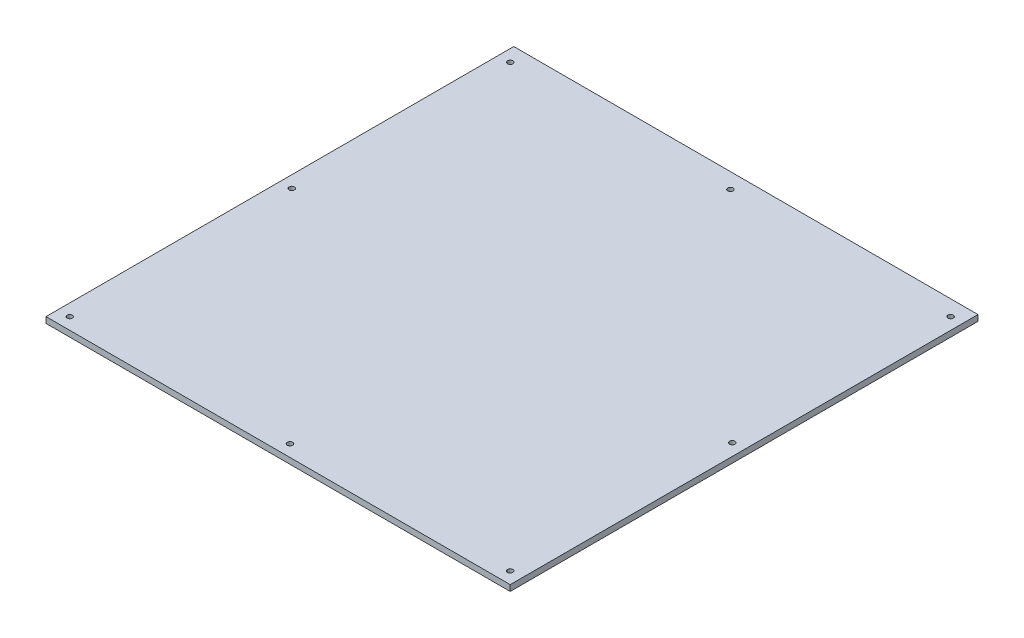
ISO-10303-21;
HEADER;
FILE_DESCRIPTION(('STEP AP214'),'2;1');
FILE_NAME('part.step','',(''),(''),'','','');
FILE_SCHEMA(('AUTOMOTIVE_DESIGN { 1 0 10303 214 1 1 1 1 }'));
ENDSEC;
DATA;
#1=APPLICATION_CONTEXT('core data for automotive mechanical design processes');
#2=APPLICATION_PROTOCOL_DEFINITION('international standard','automotive_design',2000,#1);
#3=PRODUCT_CONTEXT('',#1,'mechanical');
#4=PRODUCT('Part','Part','',(#3));
#5=PRODUCT_RELATED_PRODUCT_CATEGORY('part','',(#4));
#6=PRODUCT_DEFINITION_FORMATION('','',#4);
#7=PRODUCT_DEFINITION_CONTEXT('part definition',#1,'design');
#8=PRODUCT_DEFINITION('design','',#6,#7);
#9=PRODUCT_DEFINITION_SHAPE('','',#8);
#10=(LENGTH_UNIT() NAMED_UNIT(*) SI_UNIT(.MILLI.,.METRE.));
#11=(NAMED_UNIT(*) PLANE_ANGLE_UNIT() SI_UNIT($,.RADIAN.));
#12=(NAMED_UNIT(*) SI_UNIT($,.STERADIAN.) SOLID_ANGLE_UNIT());
#13=UNCERTAINTY_MEASURE_WITH_UNIT(LENGTH_MEASURE(1.E-05),#10,'distance_accuracy_value','');
#14=(GEOMETRIC_REPRESENTATION_CONTEXT(3) GLOBAL_UNCERTAINTY_ASSIGNED_CONTEXT((#13)) GLOBAL_UNIT_ASSIGNED_CONTEXT((#10,
#11,#12)) REPRESENTATION_CONTEXT('',''));
#15=CARTESIAN_POINT('',(0.,0.,0.));
#16=DIRECTION('',(0.,0.,1.));
#17=DIRECTION('',(1.,0.,0.));
#18=AXIS2_PLACEMENT_3D('',#15,#16,#17);
#19=CARTESIAN_POINT('',(195.5,5.,-197.));
#20=DIRECTION('',(-1.,0.,0.));
#21=DIRECTION('',(0.,0.,1.));
#22=AXIS2_PLACEMENT_3D('',#19,#20,#21);
#23=PLANE('',#22);
#24=DIRECTION('',(0.,0.,-1.));
#25=VECTOR('',#24,1.);
#26=CARTESIAN_POINT('',(195.5,0.,-197.));
#27=LINE('',#26,#25);
#28=CARTESIAN_POINT('',(195.5,0.,197.));
#29=VERTEX_POINT('',#28);
#30=CARTESIAN_POINT('',(195.5,0.,-197.));
#31=VERTEX_POINT('',#30);
#32=EDGE_CURVE('E97',#29,#31,#27,.T.);
#33=ORIENTED_EDGE('',*,*,#32,.T.);
#34=DIRECTION('',(0.,-1.,0.));
#35=VECTOR('',#34,1.);
#36=CARTESIAN_POINT('',(195.5,5.,-197.));
#37=LINE('',#36,#35);
#38=CARTESIAN_POINT('',(195.5,5.,-197.));
#39=VERTEX_POINT('',#38);
#40=EDGE_CURVE('E11',#39,#31,#37,.T.);
#41=ORIENTED_EDGE('',*,*,#40,.F.);
#42=DIRECTION('',(0.,0.,-1.));
#43=VECTOR('',#42,1.);
#44=CARTESIAN_POINT('',(195.5,5.,-197.));
#45=LINE('',#44,#43);
#46=CARTESIAN_POINT('',(195.5,5.,197.));
#47=VERTEX_POINT('',#46);
#48=EDGE_CURVE('E85',#47,#39,#45,.T.);
#49=ORIENTED_EDGE('',*,*,#48,.F.);
#50=DIRECTION('',(0.,-1.,0.));
#51=VECTOR('',#50,1.);
#52=CARTESIAN_POINT('',(195.5,5.,197.));
#53=LINE('',#52,#51);
#54=EDGE_CURVE('E93',#47,#29,#53,.T.);
#55=ORIENTED_EDGE('',*,*,#54,.T.);
#56=EDGE_LOOP('',(#33,#41,#49,#55));
#57=FACE_BOUND('',#56,.T.);
#58=ADVANCED_FACE('F34',(#57),#23,.F.);
#59=CARTESIAN_POINT('',(-195.5,5.,-197.));
#60=DIRECTION('',(0.,0.,1.));
#61=DIRECTION('',(1.,0.,0.));
#62=AXIS2_PLACEMENT_3D('',#59,#60,#61);
#63=PLANE('',#62);
#64=DIRECTION('',(-1.,0.,0.));
#65=VECTOR('',#64,1.);
#66=CARTESIAN_POINT('',(-195.5,0.,-197.));
#67=LINE('',#66,#65);
#68=CARTESIAN_POINT('',(-195.5,0.,-197.));
#69=VERTEX_POINT('',#68);
#70=EDGE_CURVE('E89',#31,#69,#67,.T.);
#71=ORIENTED_EDGE('',*,*,#70,.T.);
#72=DIRECTION('',(0.,-1.,0.));
#73=VECTOR('',#72,1.);
#74=CARTESIAN_POINT('',(-195.5,5.,-197.));
#75=LINE('',#74,#73);
#76=CARTESIAN_POINT('',(-195.5,5.,-197.));
#77=VERTEX_POINT('',#76);
#78=EDGE_CURVE('E42',#77,#69,#75,.T.);
#79=ORIENTED_EDGE('',*,*,#78,.F.);
#80=DIRECTION('',(-1.,0.,0.));
#81=VECTOR('',#80,1.);
#82=CARTESIAN_POINT('',(-195.5,5.,-197.));
#83=LINE('',#82,#81);
#84=EDGE_CURVE('E80',#39,#77,#83,.T.);
#85=ORIENTED_EDGE('',*,*,#84,.F.);
#86=ORIENTED_EDGE('',*,*,#40,.T.);
#87=EDGE_LOOP('',(#71,#79,#85,#86));
#88=FACE_BOUND('',#87,.T.);
#89=ADVANCED_FACE('F88',(#88),#63,.F.);
#90=CARTESIAN_POINT('',(-195.5,5.,-197.));
#91=DIRECTION('',(1.,0.,0.));
#92=DIRECTION('',(0.,0.,-1.));
#93=AXIS2_PLACEMENT_3D('',#90,#91,#92);
#94=PLANE('',#93);
#95=DIRECTION('',(0.,0.,1.));
#96=VECTOR('',#95,1.);
#97=CARTESIAN_POINT('',(-195.5,0.,-197.));
#98=LINE('',#97,#96);
#99=CARTESIAN_POINT('',(-195.5,0.,197.));
#100=VERTEX_POINT('',#99);
#101=EDGE_CURVE('E67',#69,#100,#98,.T.);
#102=ORIENTED_EDGE('',*,*,#101,.T.);
#103=DIRECTION('',(0.,-1.,0.));
#104=VECTOR('',#103,1.);
#105=CARTESIAN_POINT('',(-195.5,5.,197.));
#106=LINE('',#105,#104);
#107=CARTESIAN_POINT('',(-195.5,5.,197.));
#108=VERTEX_POINT('',#107);
#109=EDGE_CURVE('E90',#108,#100,#106,.T.);
#110=ORIENTED_EDGE('',*,*,#109,.F.);
#111=DIRECTION('',(0.,0.,1.));
#112=VECTOR('',#111,1.);
#113=CARTESIAN_POINT('',(-195.5,5.,-197.));
#114=LINE('',#113,#112);
#115=EDGE_CURVE('E83',#77,#108,#114,.T.);
#116=ORIENTED_EDGE('',*,*,#115,.F.);
#117=ORIENTED_EDGE('',*,*,#78,.T.);
#118=EDGE_LOOP('',(#102,#110,#116,#117));
#119=FACE_BOUND('',#118,.T.);
#120=ADVANCED_FACE('F91',(#119),#94,.F.);
#121=CARTESIAN_POINT('',(-195.5,5.,197.));
#122=DIRECTION('',(0.,0.,-1.));
#123=DIRECTION('',(-1.,0.,0.));
#124=AXIS2_PLACEMENT_3D('',#121,#122,#123);
#125=PLANE('',#124);
#126=DIRECTION('',(1.,0.,0.));
#127=VECTOR('',#126,1.);
#128=CARTESIAN_POINT('',(-195.5,0.,197.));
#129=LINE('',#128,#127);
#130=EDGE_CURVE('E73',#100,#29,#129,.T.);
#131=ORIENTED_EDGE('',*,*,#130,.T.);
#132=ORIENTED_EDGE('',*,*,#54,.F.);
#133=DIRECTION('',(1.,0.,0.));
#134=VECTOR('',#133,1.);
#135=CARTESIAN_POINT('',(-195.5,5.,197.));
#136=LINE('',#135,#134);
#137=EDGE_CURVE('E50',#108,#47,#136,.T.);
#138=ORIENTED_EDGE('',*,*,#137,.F.);
#139=ORIENTED_EDGE('',*,*,#109,.T.);
#140=EDGE_LOOP('',(#131,#132,#138,#139));
#141=FACE_BOUND('',#140,.T.);
#142=ADVANCED_FACE('F105',(#141),#125,.F.);
#143=CARTESIAN_POINT('',(0.,5.,0.));
#144=DIRECTION('',(0.,1.,0.));
#145=DIRECTION('',(0.,0.,1.));
#146=AXIS2_PLACEMENT_3D('',#143,#144,#145);
#147=PLANE('',#146);
#148=CARTESIAN_POINT('',(185.5,5.,0.));
#149=DIRECTION('',(0.,1.,0.));
#150=DIRECTION('',(0.,0.,1.));
#151=AXIS2_PLACEMENT_3D('',#148,#149,#150);
#152=CIRCLE('',#151,2.25000000000001);
#153=CARTESIAN_POINT('',(185.5,5.,2.25000000000001));
#154=VERTEX_POINT('',#153);
#155=EDGE_CURVE('E129',#154,#154,#152,.T.);
#156=ORIENTED_EDGE('',*,*,#155,.F.);
#157=EDGE_LOOP('',(#156));
#158=FACE_BOUND('',#157,.T.);
#159=CARTESIAN_POINT('',(185.5,5.,187.));
#160=DIRECTION('',(0.,1.,0.));
#161=DIRECTION('',(0.,0.,1.));
#162=AXIS2_PLACEMENT_3D('',#159,#160,#161);
#163=CIRCLE('',#162,2.25000000000001);
#164=CARTESIAN_POINT('',(185.5,5.,189.25));
#165=VERTEX_POINT('',#164);
#166=EDGE_CURVE('E136',#165,#165,#163,.T.);
#167=ORIENTED_EDGE('',*,*,#166,.F.);
#168=EDGE_LOOP('',(#167));
#169=FACE_BOUND('',#168,.T.);
#170=CARTESIAN_POINT('',(-185.5,5.,187.));
#171=DIRECTION('',(0.,1.,0.));
#172=DIRECTION('',(0.,0.,1.));
#173=AXIS2_PLACEMENT_3D('',#170,#171,#172);
#174=CIRCLE('',#173,2.25000000000001);
#175=CARTESIAN_POINT('',(-185.5,5.,189.25));
#176=VERTEX_POINT('',#175);
#177=EDGE_CURVE('E117',#176,#176,#174,.T.);
#178=ORIENTED_EDGE('',*,*,#177,.F.);
#179=EDGE_LOOP('',(#178));
#180=FACE_BOUND('',#179,.T.);
#181=CARTESIAN_POINT('',(185.5,5.,-184.));
#182=DIRECTION('',(0.,1.,0.));
#183=DIRECTION('',(0.,0.,1.));
#184=AXIS2_PLACEMENT_3D('',#181,#182,#183);
#185=CIRCLE('',#184,2.25000000000001);
#186=CARTESIAN_POINT('',(185.5,5.,-181.75));
#187=VERTEX_POINT('',#186);
#188=EDGE_CURVE('E124',#187,#187,#185,.T.);
#189=ORIENTED_EDGE('',*,*,#188,.F.);
#190=EDGE_LOOP('',(#189));
#191=FACE_BOUND('',#190,.T.);
#192=CARTESIAN_POINT('',(-185.5,5.,0.));
#193=DIRECTION('',(0.,1.,0.));
#194=DIRECTION('',(0.,0.,1.));
#195=AXIS2_PLACEMENT_3D('',#192,#193,#194);
#196=CIRCLE('',#195,2.25000000000001);
#197=CARTESIAN_POINT('',(-185.5,5.,2.25000000000001));
#198=VERTEX_POINT('',#197);
#199=EDGE_CURVE('E153',#198,#198,#196,.T.);
#200=ORIENTED_EDGE('',*,*,#199,.F.);
#201=EDGE_LOOP('',(#200));
#202=FACE_BOUND('',#201,.T.);
#203=CARTESIAN_POINT('',(0.,5.,-184.));
#204=DIRECTION('',(0.,1.,0.));
#205=DIRECTION('',(0.,0.,1.));
#206=AXIS2_PLACEMENT_3D('',#203,#204,#205);
#207=CIRCLE('',#206,2.25);
#208=CARTESIAN_POINT('',(0.,5.,-181.75));
#209=VERTEX_POINT('',#208);
#210=EDGE_CURVE('E147',#209,#209,#207,.T.);
#211=ORIENTED_EDGE('',*,*,#210,.F.);
#212=EDGE_LOOP('',(#211));
#213=FACE_BOUND('',#212,.T.);
#214=CARTESIAN_POINT('',(0.,5.,187.));
#215=DIRECTION('',(0.,1.,0.));
#216=DIRECTION('',(0.,0.,1.));
#217=AXIS2_PLACEMENT_3D('',#214,#215,#216);
#218=CIRCLE('',#217,2.25);
#219=CARTESIAN_POINT('',(0.,5.,189.25));
#220=VERTEX_POINT('',#219);
#221=EDGE_CURVE('E141',#220,#220,#218,.T.);
#222=ORIENTED_EDGE('',*,*,#221,.F.);
#223=EDGE_LOOP('',(#222));
#224=FACE_BOUND('',#223,.T.);
#225=CARTESIAN_POINT('',(-185.5,5.,-184.));
#226=DIRECTION('',(0.,1.,0.));
#227=DIRECTION('',(0.,0.,1.));
#228=AXIS2_PLACEMENT_3D('',#225,#226,#227);
#229=CIRCLE('',#228,2.25000000000001);
#230=CARTESIAN_POINT('',(-185.5,5.,-181.75));
#231=VERTEX_POINT('',#230);
#232=EDGE_CURVE('E111',#231,#231,#229,.T.);
#233=ORIENTED_EDGE('',*,*,#232,.F.);
#234=EDGE_LOOP('',(#233));
#235=FACE_BOUND('',#234,.T.);
#236=ORIENTED_EDGE('',*,*,#48,.T.);
#237=ORIENTED_EDGE('',*,*,#84,.T.);
#238=ORIENTED_EDGE('',*,*,#115,.T.);
#239=ORIENTED_EDGE('',*,*,#137,.T.);
#240=EDGE_LOOP('',(#236,#237,#238,#239));
#241=FACE_BOUND('',#240,.T.);
#242=ADVANCED_FACE('F81',(#158,#169,#180,#191,#202,#213,#224,#235,#241),#147,.T.);
#243=CARTESIAN_POINT('',(0.,0.,0.));
#244=DIRECTION('',(0.,1.,0.));
#245=DIRECTION('',(0.,0.,1.));
#246=AXIS2_PLACEMENT_3D('',#243,#244,#245);
#247=PLANE('',#246);
#248=CARTESIAN_POINT('',(185.5,0.,0.));
#249=DIRECTION('',(0.,1.,0.));
#250=DIRECTION('',(0.,0.,1.));
#251=AXIS2_PLACEMENT_3D('',#248,#249,#250);
#252=CIRCLE('',#251,2.25000000000001);
#253=CARTESIAN_POINT('',(185.5,0.,2.25000000000001));
#254=VERTEX_POINT('',#253);
#255=EDGE_CURVE('E132',#254,#254,#252,.T.);
#256=ORIENTED_EDGE('',*,*,#255,.T.);
#257=EDGE_LOOP('',(#256));
#258=FACE_BOUND('',#257,.T.);
#259=CARTESIAN_POINT('',(185.5,0.,187.));
#260=DIRECTION('',(0.,1.,0.));
#261=DIRECTION('',(0.,0.,1.));
#262=AXIS2_PLACEMENT_3D('',#259,#260,#261);
#263=CIRCLE('',#262,2.25000000000001);
#264=CARTESIAN_POINT('',(185.5,0.,189.25));
#265=VERTEX_POINT('',#264);
#266=EDGE_CURVE('E121',#265,#265,#263,.T.);
#267=ORIENTED_EDGE('',*,*,#266,.T.);
#268=EDGE_LOOP('',(#267));
#269=FACE_BOUND('',#268,.T.);
#270=CARTESIAN_POINT('',(-185.5,0.,187.));
#271=DIRECTION('',(0.,1.,0.));
#272=DIRECTION('',(0.,0.,1.));
#273=AXIS2_PLACEMENT_3D('',#270,#271,#272);
#274=CIRCLE('',#273,2.25000000000001);
#275=CARTESIAN_POINT('',(-185.5,0.,189.25));
#276=VERTEX_POINT('',#275);
#277=EDGE_CURVE('E120',#276,#276,#274,.T.);
#278=ORIENTED_EDGE('',*,*,#277,.T.);
#279=EDGE_LOOP('',(#278));
#280=FACE_BOUND('',#279,.T.);
#281=CARTESIAN_POINT('',(185.5,0.,-184.));
#282=DIRECTION('',(0.,1.,0.));
#283=DIRECTION('',(0.,0.,1.));
#284=AXIS2_PLACEMENT_3D('',#281,#282,#283);
#285=CIRCLE('',#284,2.25000000000001);
#286=CARTESIAN_POINT('',(185.5,0.,-181.75));
#287=VERTEX_POINT('',#286);
#288=EDGE_CURVE('E114',#287,#287,#285,.T.);
#289=ORIENTED_EDGE('',*,*,#288,.T.);
#290=EDGE_LOOP('',(#289));
#291=FACE_BOUND('',#290,.T.);
#292=CARTESIAN_POINT('',(-185.5,0.,0.));
#293=DIRECTION('',(0.,1.,0.));
#294=DIRECTION('',(0.,0.,1.));
#295=AXIS2_PLACEMENT_3D('',#292,#293,#294);
#296=CIRCLE('',#295,2.25000000000001);
#297=CARTESIAN_POINT('',(-185.5,0.,2.25000000000001));
#298=VERTEX_POINT('',#297);
#299=EDGE_CURVE('E133',#298,#298,#296,.T.);
#300=ORIENTED_EDGE('',*,*,#299,.T.);
#301=EDGE_LOOP('',(#300));
#302=FACE_BOUND('',#301,.T.);
#303=CARTESIAN_POINT('',(0.,0.,-184.));
#304=DIRECTION('',(0.,1.,0.));
#305=DIRECTION('',(0.,0.,1.));
#306=AXIS2_PLACEMENT_3D('',#303,#304,#305);
#307=CIRCLE('',#306,2.25);
#308=CARTESIAN_POINT('',(0.,0.,-181.75));
#309=VERTEX_POINT('',#308);
#310=EDGE_CURVE('E150',#309,#309,#307,.T.);
#311=ORIENTED_EDGE('',*,*,#310,.T.);
#312=EDGE_LOOP('',(#311));
#313=FACE_BOUND('',#312,.T.);
#314=CARTESIAN_POINT('',(0.,0.,187.));
#315=DIRECTION('',(0.,1.,0.));
#316=DIRECTION('',(0.,0.,1.));
#317=AXIS2_PLACEMENT_3D('',#314,#315,#316);
#318=CIRCLE('',#317,2.25);
#319=CARTESIAN_POINT('',(0.,0.,189.25));
#320=VERTEX_POINT('',#319);
#321=EDGE_CURVE('E144',#320,#320,#318,.T.);
#322=ORIENTED_EDGE('',*,*,#321,.T.);
#323=EDGE_LOOP('',(#322));
#324=FACE_BOUND('',#323,.T.);
#325=CARTESIAN_POINT('',(-185.5,0.,-184.));
#326=DIRECTION('',(0.,1.,0.));
#327=DIRECTION('',(0.,0.,1.));
#328=AXIS2_PLACEMENT_3D('',#325,#326,#327);
#329=CIRCLE('',#328,2.25000000000001);
#330=CARTESIAN_POINT('',(-185.5,0.,-181.75));
#331=VERTEX_POINT('',#330);
#332=EDGE_CURVE('E100',#331,#331,#329,.T.);
#333=ORIENTED_EDGE('',*,*,#332,.T.);
#334=EDGE_LOOP('',(#333));
#335=FACE_BOUND('',#334,.T.);
#336=ORIENTED_EDGE('',*,*,#32,.F.);
#337=ORIENTED_EDGE('',*,*,#130,.F.);
#338=ORIENTED_EDGE('',*,*,#101,.F.);
#339=ORIENTED_EDGE('',*,*,#70,.F.);
#340=EDGE_LOOP('',(#336,#337,#338,#339));
#341=FACE_BOUND('',#340,.T.);
#342=ADVANCED_FACE('F108',(#258,#269,#280,#291,#302,#313,#324,#335,#341),#247,.F.);
#343=CARTESIAN_POINT('',(-185.5,0.,-184.));
#344=DIRECTION('',(0.,1.,0.));
#345=DIRECTION('',(0.,0.,1.));
#346=AXIS2_PLACEMENT_3D('',#343,#344,#345);
#347=CYLINDRICAL_SURFACE('',#346,2.25000000000001);
#348=ORIENTED_EDGE('',*,*,#332,.F.);
#349=EDGE_LOOP('',(#348));
#350=FACE_BOUND('',#349,.T.);
#351=ORIENTED_EDGE('',*,*,#232,.T.);
#352=EDGE_LOOP('',(#351));
#353=FACE_BOUND('',#352,.T.);
#354=ADVANCED_FACE('F179',(#350,#353),#347,.F.);
#355=CARTESIAN_POINT('',(0.,0.,187.));
#356=DIRECTION('',(0.,1.,0.));
#357=DIRECTION('',(0.,0.,1.));
#358=AXIS2_PLACEMENT_3D('',#355,#356,#357);
#359=CYLINDRICAL_SURFACE('',#358,2.25);
#360=ORIENTED_EDGE('',*,*,#321,.F.);
#361=EDGE_LOOP('',(#360));
#362=FACE_BOUND('',#361,.T.);
#363=ORIENTED_EDGE('',*,*,#221,.T.);
#364=EDGE_LOOP('',(#363));
#365=FACE_BOUND('',#364,.T.);
#366=ADVANCED_FACE('F181',(#362,#365),#359,.F.);
#367=CARTESIAN_POINT('',(0.,0.,-184.));
#368=DIRECTION('',(0.,1.,0.));
#369=DIRECTION('',(0.,0.,1.));
#370=AXIS2_PLACEMENT_3D('',#367,#368,#369);
#371=CYLINDRICAL_SURFACE('',#370,2.25);
#372=ORIENTED_EDGE('',*,*,#310,.F.);
#373=EDGE_LOOP('',(#372));
#374=FACE_BOUND('',#373,.T.);
#375=ORIENTED_EDGE('',*,*,#210,.T.);
#376=EDGE_LOOP('',(#375));
#377=FACE_BOUND('',#376,.T.);
#378=ADVANCED_FACE('F165',(#374,#377),#371,.F.);
#379=CARTESIAN_POINT('',(-185.5,0.,0.));
#380=DIRECTION('',(0.,1.,0.));
#381=DIRECTION('',(0.,0.,1.));
#382=AXIS2_PLACEMENT_3D('',#379,#380,#381);
#383=CYLINDRICAL_SURFACE('',#382,2.25000000000001);
#384=ORIENTED_EDGE('',*,*,#299,.F.);
#385=EDGE_LOOP('',(#384));
#386=FACE_BOUND('',#385,.T.);
#387=ORIENTED_EDGE('',*,*,#199,.T.);
#388=EDGE_LOOP('',(#387));
#389=FACE_BOUND('',#388,.T.);
#390=ADVANCED_FACE('F161',(#386,#389),#383,.F.);
#391=CARTESIAN_POINT('',(185.5,0.,-184.));
#392=DIRECTION('',(0.,1.,0.));
#393=DIRECTION('',(0.,0.,1.));
#394=AXIS2_PLACEMENT_3D('',#391,#392,#393);
#395=CYLINDRICAL_SURFACE('',#394,2.25000000000001);
#396=ORIENTED_EDGE('',*,*,#288,.F.);
#397=EDGE_LOOP('',(#396));
#398=FACE_BOUND('',#397,.T.);
#399=ORIENTED_EDGE('',*,*,#188,.T.);
#400=EDGE_LOOP('',(#399));
#401=FACE_BOUND('',#400,.T.);
#402=ADVANCED_FACE('F164',(#398,#401),#395,.F.);
#403=CARTESIAN_POINT('',(-185.5,0.,187.));
#404=DIRECTION('',(0.,1.,0.));
#405=DIRECTION('',(0.,0.,1.));
#406=AXIS2_PLACEMENT_3D('',#403,#404,#405);
#407=CYLINDRICAL_SURFACE('',#406,2.25000000000001);
#408=ORIENTED_EDGE('',*,*,#277,.F.);
#409=EDGE_LOOP('',(#408));
#410=FACE_BOUND('',#409,.T.);
#411=ORIENTED_EDGE('',*,*,#177,.T.);
#412=EDGE_LOOP('',(#411));
#413=FACE_BOUND('',#412,.T.);
#414=ADVANCED_FACE('F250',(#410,#413),#407,.F.);
#415=CARTESIAN_POINT('',(185.5,0.,187.));
#416=DIRECTION('',(0.,1.,0.));
#417=DIRECTION('',(0.,0.,1.));
#418=AXIS2_PLACEMENT_3D('',#415,#416,#417);
#419=CYLINDRICAL_SURFACE('',#418,2.25000000000001);
#420=ORIENTED_EDGE('',*,*,#266,.F.);
#421=EDGE_LOOP('',(#420));
#422=FACE_BOUND('',#421,.T.);
#423=ORIENTED_EDGE('',*,*,#166,.T.);
#424=EDGE_LOOP('',(#423));
#425=FACE_BOUND('',#424,.T.);
#426=ADVANCED_FACE('F260',(#422,#425),#419,.F.);
#427=CARTESIAN_POINT('',(185.5,0.,0.));
#428=DIRECTION('',(0.,1.,0.));
#429=DIRECTION('',(0.,0.,1.));
#430=AXIS2_PLACEMENT_3D('',#427,#428,#429);
#431=CYLINDRICAL_SURFACE('',#430,2.25000000000001);
#432=ORIENTED_EDGE('',*,*,#255,.F.);
#433=EDGE_LOOP('',(#432));
#434=FACE_BOUND('',#433,.T.);
#435=ORIENTED_EDGE('',*,*,#155,.T.);
#436=EDGE_LOOP('',(#435));
#437=FACE_BOUND('',#436,.T.);
#438=ADVANCED_FACE('F269',(#434,#437),#431,.F.);
#439=CLOSED_SHELL('',(#58,#89,#120,#142,#242,#342,#354,#366,#378,#390,#402,#414,#426,#438));
#440=MANIFOLD_SOLID_BREP('B2',#439);
#441=ADVANCED_BREP_SHAPE_REPRESENTATION('',(#18,#440),#14);
#442=SHAPE_DEFINITION_REPRESENTATION(#9,#441);
ENDSEC;
END-ISO-10303-21;
